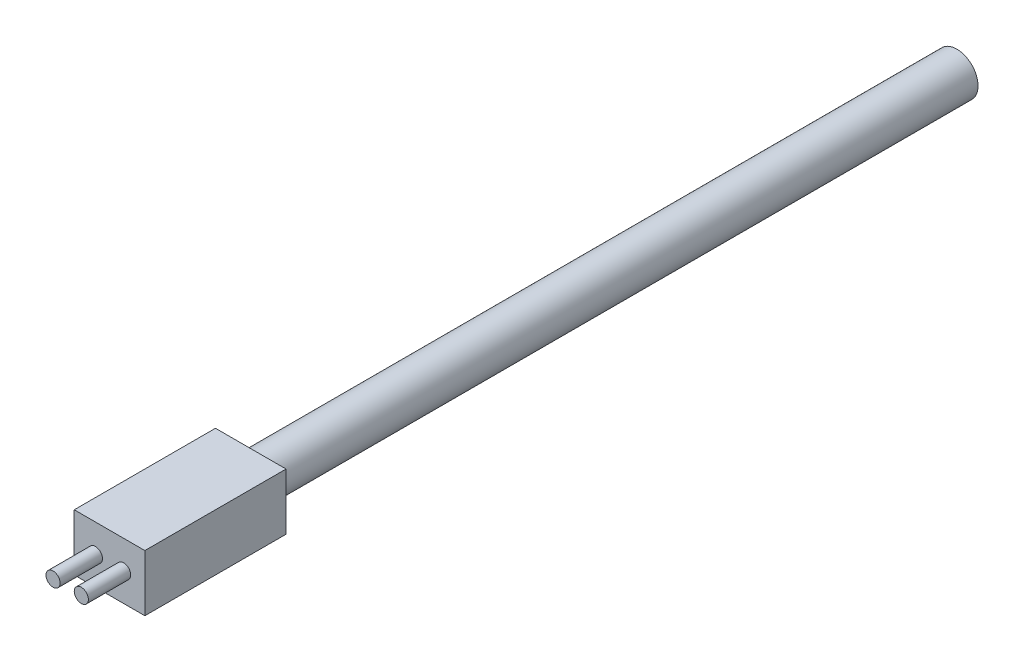
ISO-10303-21;
HEADER;
FILE_DESCRIPTION(('STEP AP214'),'2;1');
FILE_NAME('part.step','',(''),(''),'','','');
FILE_SCHEMA(('AUTOMOTIVE_DESIGN { 1 0 10303 214 1 1 1 1 }'));
ENDSEC;
DATA;
#1=APPLICATION_CONTEXT('core data for automotive mechanical design processes');
#2=APPLICATION_PROTOCOL_DEFINITION('international standard','automotive_design',2000,#1);
#3=PRODUCT_CONTEXT('',#1,'mechanical');
#4=PRODUCT('Part','Part','',(#3));
#5=PRODUCT_RELATED_PRODUCT_CATEGORY('part','',(#4));
#6=PRODUCT_DEFINITION_FORMATION('','',#4);
#7=PRODUCT_DEFINITION_CONTEXT('part definition',#1,'design');
#8=PRODUCT_DEFINITION('design','',#6,#7);
#9=PRODUCT_DEFINITION_SHAPE('','',#8);
#10=(LENGTH_UNIT() NAMED_UNIT(*) SI_UNIT(.MILLI.,.METRE.));
#11=(NAMED_UNIT(*) PLANE_ANGLE_UNIT() SI_UNIT($,.RADIAN.));
#12=(NAMED_UNIT(*) SI_UNIT($,.STERADIAN.) SOLID_ANGLE_UNIT());
#13=UNCERTAINTY_MEASURE_WITH_UNIT(LENGTH_MEASURE(1.E-05),#10,'distance_accuracy_value','');
#14=(GEOMETRIC_REPRESENTATION_CONTEXT(3) GLOBAL_UNCERTAINTY_ASSIGNED_CONTEXT((#13)) GLOBAL_UNIT_ASSIGNED_CONTEXT((#10,
#11,#12)) REPRESENTATION_CONTEXT('',''));
#15=CARTESIAN_POINT('',(0.,0.,0.));
#16=DIRECTION('',(0.,0.,1.));
#17=DIRECTION('',(1.,0.,0.));
#18=AXIS2_PLACEMENT_3D('',#15,#16,#17);
#19=CARTESIAN_POINT('',(2.5,4.,-5.));
#20=DIRECTION('',(-1.,0.,0.));
#21=DIRECTION('',(0.,0.,1.));
#22=AXIS2_PLACEMENT_3D('',#19,#20,#21);
#23=PLANE('',#22);
#24=DIRECTION('',(0.,0.,-1.));
#25=VECTOR('',#24,1.);
#26=CARTESIAN_POINT('',(2.5,0.,-5.));
#27=LINE('',#26,#25);
#28=CARTESIAN_POINT('',(2.5,0.,5.));
#29=VERTEX_POINT('',#28);
#30=CARTESIAN_POINT('',(2.5,0.,-5.));
#31=VERTEX_POINT('',#30);
#32=EDGE_CURVE('E114',#29,#31,#27,.T.);
#33=ORIENTED_EDGE('',*,*,#32,.T.);
#34=DIRECTION('',(0.,-1.,0.));
#35=VECTOR('',#34,1.);
#36=CARTESIAN_POINT('',(2.5,4.,-5.));
#37=LINE('',#36,#35);
#38=CARTESIAN_POINT('',(2.5,4.,-5.));
#39=VERTEX_POINT('',#38);
#40=EDGE_CURVE('E103',#39,#31,#37,.T.);
#41=ORIENTED_EDGE('',*,*,#40,.F.);
#42=DIRECTION('',(0.,0.,-1.));
#43=VECTOR('',#42,1.);
#44=CARTESIAN_POINT('',(2.5,4.,-5.));
#45=LINE('',#44,#43);
#46=CARTESIAN_POINT('',(2.5,4.,5.));
#47=VERTEX_POINT('',#46);
#48=EDGE_CURVE('E95',#47,#39,#45,.T.);
#49=ORIENTED_EDGE('',*,*,#48,.F.);
#50=DIRECTION('',(0.,-1.,0.));
#51=VECTOR('',#50,1.);
#52=CARTESIAN_POINT('',(2.5,4.,5.));
#53=LINE('',#52,#51);
#54=EDGE_CURVE('E110',#47,#29,#53,.T.);
#55=ORIENTED_EDGE('',*,*,#54,.T.);
#56=EDGE_LOOP('',(#33,#41,#49,#55));
#57=FACE_BOUND('',#56,.T.);
#58=ADVANCED_FACE('F41',(#57),#23,.F.);
#59=CARTESIAN_POINT('',(-2.5,4.,-5.));
#60=DIRECTION('',(0.,0.,1.));
#61=DIRECTION('',(1.,0.,0.));
#62=AXIS2_PLACEMENT_3D('',#59,#60,#61);
#63=PLANE('',#62);
#64=CARTESIAN_POINT('',(0.,2.,-5.));
#65=DIRECTION('',(0.,0.,-1.));
#66=DIRECTION('',(-1.,0.,0.));
#67=AXIS2_PLACEMENT_3D('',#64,#65,#66);
#68=CIRCLE('',#67,1.5);
#69=CARTESIAN_POINT('',(-1.5,2.,-5.));
#70=VERTEX_POINT('',#69);
#71=EDGE_CURVE('E11',#70,#70,#68,.T.);
#72=ORIENTED_EDGE('',*,*,#71,.F.);
#73=EDGE_LOOP('',(#72));
#74=FACE_BOUND('',#73,.T.);
#75=DIRECTION('',(-1.,0.,0.));
#76=VECTOR('',#75,1.);
#77=CARTESIAN_POINT('',(-2.5,0.,-5.));
#78=LINE('',#77,#76);
#79=CARTESIAN_POINT('',(-2.5,0.,-5.));
#80=VERTEX_POINT('',#79);
#81=EDGE_CURVE('E101',#31,#80,#78,.T.);
#82=ORIENTED_EDGE('',*,*,#81,.T.);
#83=DIRECTION('',(0.,-1.,0.));
#84=VECTOR('',#83,1.);
#85=CARTESIAN_POINT('',(-2.5,4.,-5.));
#86=LINE('',#85,#84);
#87=CARTESIAN_POINT('',(-2.5,4.,-5.));
#88=VERTEX_POINT('',#87);
#89=EDGE_CURVE('E99',#88,#80,#86,.T.);
#90=ORIENTED_EDGE('',*,*,#89,.F.);
#91=DIRECTION('',(-1.,0.,0.));
#92=VECTOR('',#91,1.);
#93=CARTESIAN_POINT('',(-2.5,4.,-5.));
#94=LINE('',#93,#92);
#95=EDGE_CURVE('E90',#39,#88,#94,.T.);
#96=ORIENTED_EDGE('',*,*,#95,.F.);
#97=ORIENTED_EDGE('',*,*,#40,.T.);
#98=EDGE_LOOP('',(#82,#90,#96,#97));
#99=FACE_BOUND('',#98,.T.);
#100=ADVANCED_FACE('F100',(#74,#99),#63,.F.);
#101=CARTESIAN_POINT('',(-2.5,4.,-5.));
#102=DIRECTION('',(1.,0.,0.));
#103=DIRECTION('',(0.,0.,-1.));
#104=AXIS2_PLACEMENT_3D('',#101,#102,#103);
#105=PLANE('',#104);
#106=DIRECTION('',(0.,0.,1.));
#107=VECTOR('',#106,1.);
#108=CARTESIAN_POINT('',(-2.5,0.,-5.));
#109=LINE('',#108,#107);
#110=CARTESIAN_POINT('',(-2.5,0.,5.));
#111=VERTEX_POINT('',#110);
#112=EDGE_CURVE('E76',#80,#111,#109,.T.);
#113=ORIENTED_EDGE('',*,*,#112,.T.);
#114=DIRECTION('',(0.,-1.,0.));
#115=VECTOR('',#114,1.);
#116=CARTESIAN_POINT('',(-2.5,4.,5.));
#117=LINE('',#116,#115);
#118=CARTESIAN_POINT('',(-2.5,4.,5.));
#119=VERTEX_POINT('',#118);
#120=EDGE_CURVE('E104',#119,#111,#117,.T.);
#121=ORIENTED_EDGE('',*,*,#120,.F.);
#122=DIRECTION('',(0.,0.,1.));
#123=VECTOR('',#122,1.);
#124=CARTESIAN_POINT('',(-2.5,4.,-5.));
#125=LINE('',#124,#123);
#126=EDGE_CURVE('E93',#88,#119,#125,.T.);
#127=ORIENTED_EDGE('',*,*,#126,.F.);
#128=ORIENTED_EDGE('',*,*,#89,.T.);
#129=EDGE_LOOP('',(#113,#121,#127,#128));
#130=FACE_BOUND('',#129,.T.);
#131=ADVANCED_FACE('F106',(#130),#105,.F.);
#132=CARTESIAN_POINT('',(-2.5,4.,5.));
#133=DIRECTION('',(0.,0.,-1.));
#134=DIRECTION('',(-1.,0.,0.));
#135=AXIS2_PLACEMENT_3D('',#132,#133,#134);
#136=PLANE('',#135);
#137=CARTESIAN_POINT('',(1.,2.,5.));
#138=DIRECTION('',(0.,0.,-1.));
#139=DIRECTION('',(-1.,0.,0.));
#140=AXIS2_PLACEMENT_3D('',#137,#138,#139);
#141=CIRCLE('',#140,0.5);
#142=CARTESIAN_POINT('',(0.5,2.,5.));
#143=VERTEX_POINT('',#142);
#144=EDGE_CURVE('E44',#143,#143,#141,.F.);
#145=ORIENTED_EDGE('',*,*,#144,.F.);
#146=EDGE_LOOP('',(#145));
#147=FACE_BOUND('',#146,.T.);
#148=CARTESIAN_POINT('',(-1.,2.,5.));
#149=DIRECTION('',(0.,0.,-1.));
#150=DIRECTION('',(-1.,0.,0.));
#151=AXIS2_PLACEMENT_3D('',#148,#149,#150);
#152=CIRCLE('',#151,0.5);
#153=CARTESIAN_POINT('',(-1.5,2.,5.));
#154=VERTEX_POINT('',#153);
#155=EDGE_CURVE('E130',#154,#154,#152,.F.);
#156=ORIENTED_EDGE('',*,*,#155,.F.);
#157=EDGE_LOOP('',(#156));
#158=FACE_BOUND('',#157,.T.);
#159=DIRECTION('',(1.,0.,0.));
#160=VECTOR('',#159,1.);
#161=CARTESIAN_POINT('',(-2.5,0.,5.));
#162=LINE('',#161,#160);
#163=EDGE_CURVE('E82',#111,#29,#162,.T.);
#164=ORIENTED_EDGE('',*,*,#163,.T.);
#165=ORIENTED_EDGE('',*,*,#54,.F.);
#166=DIRECTION('',(1.,0.,0.));
#167=VECTOR('',#166,1.);
#168=CARTESIAN_POINT('',(-2.5,4.,5.));
#169=LINE('',#168,#167);
#170=EDGE_CURVE('E59',#119,#47,#169,.T.);
#171=ORIENTED_EDGE('',*,*,#170,.F.);
#172=ORIENTED_EDGE('',*,*,#120,.T.);
#173=EDGE_LOOP('',(#164,#165,#171,#172));
#174=FACE_BOUND('',#173,.T.);
#175=ADVANCED_FACE('F141',(#147,#158,#174),#136,.F.);
#176=CARTESIAN_POINT('',(0.,4.,0.));
#177=DIRECTION('',(0.,1.,0.));
#178=DIRECTION('',(0.,0.,1.));
#179=AXIS2_PLACEMENT_3D('',#176,#177,#178);
#180=PLANE('',#179);
#181=ORIENTED_EDGE('',*,*,#48,.T.);
#182=ORIENTED_EDGE('',*,*,#95,.T.);
#183=ORIENTED_EDGE('',*,*,#126,.T.);
#184=ORIENTED_EDGE('',*,*,#170,.T.);
#185=EDGE_LOOP('',(#181,#182,#183,#184));
#186=FACE_BOUND('',#185,.T.);
#187=ADVANCED_FACE('F91',(#186),#180,.T.);
#188=CARTESIAN_POINT('',(0.,0.,0.));
#189=DIRECTION('',(0.,1.,0.));
#190=DIRECTION('',(0.,0.,1.));
#191=AXIS2_PLACEMENT_3D('',#188,#189,#190);
#192=PLANE('',#191);
#193=ORIENTED_EDGE('',*,*,#32,.F.);
#194=ORIENTED_EDGE('',*,*,#163,.F.);
#195=ORIENTED_EDGE('',*,*,#112,.F.);
#196=ORIENTED_EDGE('',*,*,#81,.F.);
#197=EDGE_LOOP('',(#193,#194,#195,#196));
#198=FACE_BOUND('',#197,.T.);
#199=ADVANCED_FACE('F149',(#198),#192,.F.);
#200=CARTESIAN_POINT('',(-1.,2.,8.));
#201=DIRECTION('',(0.,0.,-1.));
#202=DIRECTION('',(-1.,0.,0.));
#203=AXIS2_PLACEMENT_3D('',#200,#201,#202);
#204=CYLINDRICAL_SURFACE('',#203,0.5);
#205=CARTESIAN_POINT('',(-1.,2.,8.));
#206=DIRECTION('',(0.,0.,1.));
#207=DIRECTION('',(1.,0.,0.));
#208=AXIS2_PLACEMENT_3D('',#205,#206,#207);
#209=CIRCLE('',#208,0.5);
#210=CARTESIAN_POINT('',(-0.5,2.,8.));
#211=VERTEX_POINT('',#210);
#212=EDGE_CURVE('E118',#211,#211,#209,.T.);
#213=ORIENTED_EDGE('',*,*,#212,.F.);
#214=EDGE_LOOP('',(#213));
#215=FACE_BOUND('',#214,.T.);
#216=ORIENTED_EDGE('',*,*,#155,.T.);
#217=EDGE_LOOP('',(#216));
#218=FACE_BOUND('',#217,.T.);
#219=ADVANCED_FACE('F162',(#215,#218),#204,.T.);
#220=CARTESIAN_POINT('',(-1.,2.,8.));
#221=DIRECTION('',(0.,0.,1.));
#222=DIRECTION('',(1.,0.,0.));
#223=AXIS2_PLACEMENT_3D('',#220,#221,#222);
#224=PLANE('',#223);
#225=ORIENTED_EDGE('',*,*,#212,.T.);
#226=EDGE_LOOP('',(#225));
#227=FACE_BOUND('',#226,.T.);
#228=ADVANCED_FACE('F166',(#227),#224,.T.);
#229=CARTESIAN_POINT('',(1.,2.,8.));
#230=DIRECTION('',(0.,0.,-1.));
#231=DIRECTION('',(-1.,0.,0.));
#232=AXIS2_PLACEMENT_3D('',#229,#230,#231);
#233=CYLINDRICAL_SURFACE('',#232,0.5);
#234=CARTESIAN_POINT('',(1.,2.,8.));
#235=DIRECTION('',(0.,0.,1.));
#236=DIRECTION('',(1.,0.,0.));
#237=AXIS2_PLACEMENT_3D('',#234,#235,#236);
#238=CIRCLE('',#237,0.5);
#239=CARTESIAN_POINT('',(1.5,2.,8.));
#240=VERTEX_POINT('',#239);
#241=EDGE_CURVE('E193',#240,#240,#238,.T.);
#242=ORIENTED_EDGE('',*,*,#241,.F.);
#243=EDGE_LOOP('',(#242));
#244=FACE_BOUND('',#243,.T.);
#245=ORIENTED_EDGE('',*,*,#144,.T.);
#246=EDGE_LOOP('',(#245));
#247=FACE_BOUND('',#246,.T.);
#248=ADVANCED_FACE('F139',(#244,#247),#233,.T.);
#249=CARTESIAN_POINT('',(1.,2.,8.));
#250=DIRECTION('',(0.,0.,1.));
#251=DIRECTION('',(1.,0.,0.));
#252=AXIS2_PLACEMENT_3D('',#249,#250,#251);
#253=PLANE('',#252);
#254=ORIENTED_EDGE('',*,*,#241,.T.);
#255=EDGE_LOOP('',(#254));
#256=FACE_BOUND('',#255,.T.);
#257=ADVANCED_FACE('F175',(#256),#253,.T.);
#258=CARTESIAN_POINT('',(0.,2.,-55.));
#259=DIRECTION('',(0.,0.,1.));
#260=DIRECTION('',(1.,0.,0.));
#261=AXIS2_PLACEMENT_3D('',#258,#259,#260);
#262=CYLINDRICAL_SURFACE('',#261,1.5);
#263=CARTESIAN_POINT('',(0.,2.,-55.));
#264=DIRECTION('',(0.,0.,-1.));
#265=DIRECTION('',(-1.,0.,0.));
#266=AXIS2_PLACEMENT_3D('',#263,#264,#265);
#267=CIRCLE('',#266,1.5);
#268=CARTESIAN_POINT('',(-1.5,2.,-55.));
#269=VERTEX_POINT('',#268);
#270=EDGE_CURVE('E191',#269,#269,#267,.T.);
#271=ORIENTED_EDGE('',*,*,#270,.F.);
#272=EDGE_LOOP('',(#271));
#273=FACE_BOUND('',#272,.T.);
#274=ORIENTED_EDGE('',*,*,#71,.T.);
#275=EDGE_LOOP('',(#274));
#276=FACE_BOUND('',#275,.T.);
#277=ADVANCED_FACE('F179',(#273,#276),#262,.T.);
#278=CARTESIAN_POINT('',(0.,2.,-55.));
#279=DIRECTION('',(0.,0.,-1.));
#280=DIRECTION('',(-1.,0.,0.));
#281=AXIS2_PLACEMENT_3D('',#278,#279,#280);
#282=PLANE('',#281);
#283=ORIENTED_EDGE('',*,*,#270,.T.);
#284=EDGE_LOOP('',(#283));
#285=FACE_BOUND('',#284,.T.);
#286=ADVANCED_FACE('F183',(#285),#282,.T.);
#287=CLOSED_SHELL('',(#58,#100,#131,#175,#187,#199,#219,#228,#248,#257,#277,#286));
#288=MANIFOLD_SOLID_BREP('B2',#287);
#289=ADVANCED_BREP_SHAPE_REPRESENTATION('',(#18,#288),#14);
#290=SHAPE_DEFINITION_REPRESENTATION(#9,#289);
ENDSEC;
END-ISO-10303-21;
